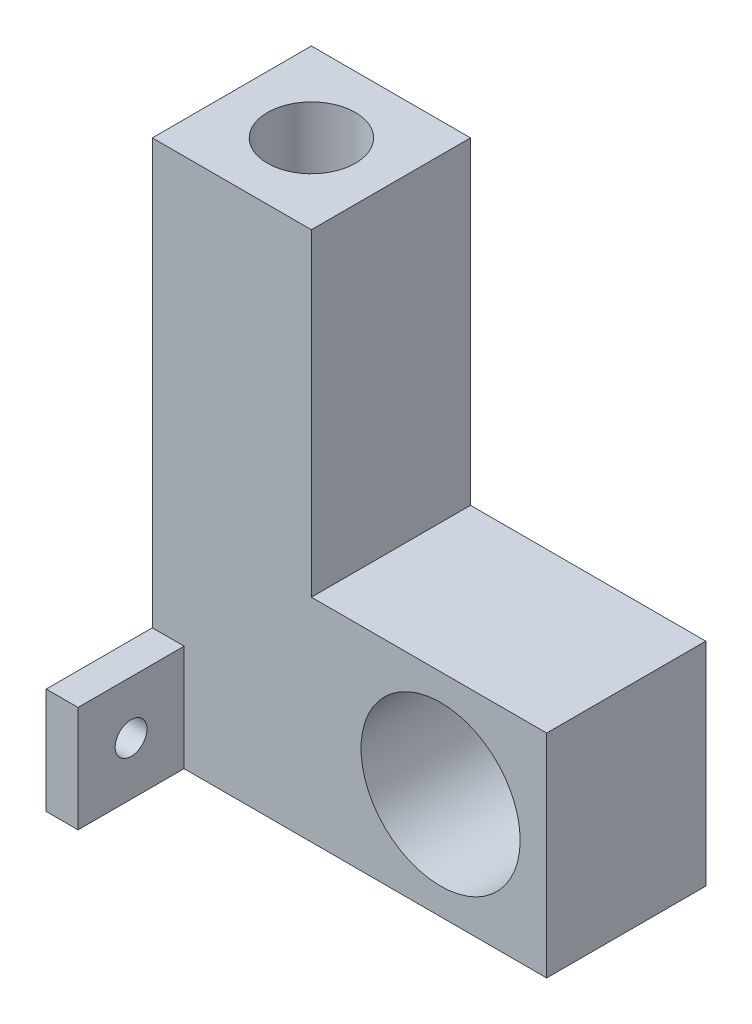
ISO-10303-21;
HEADER;
FILE_DESCRIPTION(('STEP AP214'),'2;1');
FILE_NAME('part.step','',(''),(''),'','','');
FILE_SCHEMA(('AUTOMOTIVE_DESIGN { 1 0 10303 214 1 1 1 1 }'));
ENDSEC;
DATA;
#1=APPLICATION_CONTEXT('core data for automotive mechanical design processes');
#2=APPLICATION_PROTOCOL_DEFINITION('international standard','automotive_design',2000,#1);
#3=PRODUCT_CONTEXT('',#1,'mechanical');
#4=PRODUCT('Part','Part','',(#3));
#5=PRODUCT_RELATED_PRODUCT_CATEGORY('part','',(#4));
#6=PRODUCT_DEFINITION_FORMATION('','',#4);
#7=PRODUCT_DEFINITION_CONTEXT('part definition',#1,'design');
#8=PRODUCT_DEFINITION('design','',#6,#7);
#9=PRODUCT_DEFINITION_SHAPE('','',#8);
#10=(LENGTH_UNIT() NAMED_UNIT(*) SI_UNIT(.MILLI.,.METRE.));
#11=(NAMED_UNIT(*) PLANE_ANGLE_UNIT() SI_UNIT($,.RADIAN.));
#12=(NAMED_UNIT(*) SI_UNIT($,.STERADIAN.) SOLID_ANGLE_UNIT());
#13=UNCERTAINTY_MEASURE_WITH_UNIT(LENGTH_MEASURE(1.E-05),#10,'distance_accuracy_value','');
#14=(GEOMETRIC_REPRESENTATION_CONTEXT(3) GLOBAL_UNCERTAINTY_ASSIGNED_CONTEXT((#13)) GLOBAL_UNIT_ASSIGNED_CONTEXT((#10,
#11,#12)) REPRESENTATION_CONTEXT('',''));
#15=CARTESIAN_POINT('',(0.,0.,0.));
#16=DIRECTION('',(0.,0.,1.));
#17=DIRECTION('',(1.,0.,0.));
#18=AXIS2_PLACEMENT_3D('',#15,#16,#17);
#19=CARTESIAN_POINT('',(0.,-10.,15.));
#20=DIRECTION('',(0.,-1.,0.));
#21=DIRECTION('',(0.,0.,-1.));
#22=AXIS2_PLACEMENT_3D('',#19,#20,#21);
#23=PLANE('',#22);
#24=DIRECTION('',(-1.,0.,0.));
#25=VECTOR('',#24,1.);
#26=CARTESIAN_POINT('',(0.,-10.,15.));
#27=LINE('',#26,#25);
#28=CARTESIAN_POINT('',(10.,-10.,15.));
#29=VERTEX_POINT('',#28);
#30=CARTESIAN_POINT('',(-24.1801195892989,-10.,15.));
#31=VERTEX_POINT('',#30);
#32=EDGE_CURVE('E358',#29,#31,#27,.T.);
#33=ORIENTED_EDGE('',*,*,#32,.T.);
#34=DIRECTION('',(0.,0.,1.));
#35=VECTOR('',#34,1.);
#36=CARTESIAN_POINT('',(-24.1801195892989,-10.,-10.));
#37=LINE('',#36,#35);
#38=CARTESIAN_POINT('',(-24.1801195892989,-10.,25.));
#39=VERTEX_POINT('',#38);
#40=EDGE_CURVE('E302',#31,#39,#37,.T.);
#41=ORIENTED_EDGE('',*,*,#40,.T.);
#42=DIRECTION('',(-1.,0.,0.));
#43=VECTOR('',#42,1.);
#44=CARTESIAN_POINT('',(-24.1801195892989,-10.,25.));
#45=LINE('',#44,#43);
#46=CARTESIAN_POINT('',(-27.1801195892989,-10.,25.));
#47=VERTEX_POINT('',#46);
#48=EDGE_CURVE('E292',#39,#47,#45,.T.);
#49=ORIENTED_EDGE('',*,*,#48,.T.);
#50=DIRECTION('',(0.,0.,-1.));
#51=VECTOR('',#50,1.);
#52=CARTESIAN_POINT('',(-27.1801195892989,-10.,15.));
#53=LINE('',#52,#51);
#54=CARTESIAN_POINT('',(-27.1801195892989,-10.,-10.));
#55=VERTEX_POINT('',#54);
#56=EDGE_CURVE('E286',#47,#55,#53,.T.);
#57=ORIENTED_EDGE('',*,*,#56,.T.);
#58=DIRECTION('',(-1.,0.,0.));
#59=VECTOR('',#58,1.);
#60=CARTESIAN_POINT('',(-24.1801195892989,-10.,-10.));
#61=LINE('',#60,#59);
#62=CARTESIAN_POINT('',(-24.1801195892989,-10.,-10.));
#63=VERTEX_POINT('',#62);
#64=EDGE_CURVE('E280',#63,#55,#61,.T.);
#65=ORIENTED_EDGE('',*,*,#64,.F.);
#66=CARTESIAN_POINT('',(-24.1801195892989,-10.,0.));
#67=VERTEX_POINT('',#66);
#68=EDGE_CURVE('E284',#63,#67,#37,.T.);
#69=ORIENTED_EDGE('',*,*,#68,.T.);
#70=DIRECTION('',(-1.,0.,0.));
#71=VECTOR('',#70,1.);
#72=CARTESIAN_POINT('',(0.,-10.,0.));
#73=LINE('',#72,#71);
#74=CARTESIAN_POINT('',(10.,-10.,0.));
#75=VERTEX_POINT('',#74);
#76=EDGE_CURVE('E212',#75,#67,#73,.T.);
#77=ORIENTED_EDGE('',*,*,#76,.F.);
#78=DIRECTION('',(0.,0.,-1.));
#79=VECTOR('',#78,1.);
#80=CARTESIAN_POINT('',(10.,-10.,15.));
#81=LINE('',#80,#79);
#82=EDGE_CURVE('E377',#29,#75,#81,.T.);
#83=ORIENTED_EDGE('',*,*,#82,.F.);
#84=EDGE_LOOP('',(#33,#41,#49,#57,#65,#69,#77,#83));
#85=FACE_BOUND('',#84,.T.);
#86=CARTESIAN_POINT('',(-19.6801195892989,-10.,7.5));
#87=DIRECTION('',(0.,1.,0.));
#88=DIRECTION('',(0.,0.,1.));
#89=AXIS2_PLACEMENT_3D('',#86,#87,#88);
#90=CIRCLE('',#89,4.15);
#91=CARTESIAN_POINT('',(-19.6801195892989,-10.,11.65));
#92=VERTEX_POINT('',#91);
#93=EDGE_CURVE('E347',#92,#92,#90,.T.);
#94=ORIENTED_EDGE('',*,*,#93,.T.);
#95=EDGE_LOOP('',(#94));
#96=FACE_BOUND('',#95,.T.);
#97=ADVANCED_FACE('F191',(#85,#96),#23,.T.);
#98=CARTESIAN_POINT('',(0.,10.,15.));
#99=DIRECTION('',(0.,1.,0.));
#100=DIRECTION('',(0.,0.,1.));
#101=AXIS2_PLACEMENT_3D('',#98,#99,#100);
#102=PLANE('',#101);
#103=DIRECTION('',(1.,0.,0.));
#104=VECTOR('',#103,1.);
#105=CARTESIAN_POINT('',(0.,10.,0.));
#106=LINE('',#105,#104);
#107=CARTESIAN_POINT('',(-12.1801195892989,10.,0.));
#108=VERTEX_POINT('',#107);
#109=CARTESIAN_POINT('',(10.,10.,0.));
#110=VERTEX_POINT('',#109);
#111=EDGE_CURVE('E380',#108,#110,#106,.T.);
#112=ORIENTED_EDGE('',*,*,#111,.F.);
#113=DIRECTION('',(0.,0.,-1.));
#114=VECTOR('',#113,1.);
#115=CARTESIAN_POINT('',(-12.1801195892989,10.,15.));
#116=LINE('',#115,#114);
#117=CARTESIAN_POINT('',(-12.1801195892989,10.,15.));
#118=VERTEX_POINT('',#117);
#119=EDGE_CURVE('E397',#118,#108,#116,.T.);
#120=ORIENTED_EDGE('',*,*,#119,.F.);
#121=DIRECTION('',(1.,0.,0.));
#122=VECTOR('',#121,1.);
#123=CARTESIAN_POINT('',(0.,10.,15.));
#124=LINE('',#123,#122);
#125=CARTESIAN_POINT('',(10.,10.,15.));
#126=VERTEX_POINT('',#125);
#127=EDGE_CURVE('E362',#118,#126,#124,.T.);
#128=ORIENTED_EDGE('',*,*,#127,.T.);
#129=DIRECTION('',(0.,0.,-1.));
#130=VECTOR('',#129,1.);
#131=CARTESIAN_POINT('',(10.,10.,15.));
#132=LINE('',#131,#130);
#133=EDGE_CURVE('E408',#126,#110,#132,.T.);
#134=ORIENTED_EDGE('',*,*,#133,.T.);
#135=EDGE_LOOP('',(#112,#120,#128,#134));
#136=FACE_BOUND('',#135,.T.);
#137=ADVANCED_FACE('F451',(#136),#102,.T.);
#138=CARTESIAN_POINT('',(-12.1801195892989,0.,15.));
#139=DIRECTION('',(-1.,0.,0.));
#140=DIRECTION('',(0.,0.,1.));
#141=AXIS2_PLACEMENT_3D('',#138,#139,#140);
#142=PLANE('',#141);
#143=DIRECTION('',(0.,1.,0.));
#144=VECTOR('',#143,1.);
#145=CARTESIAN_POINT('',(-12.1801195892989,0.,0.));
#146=LINE('',#145,#144);
#147=CARTESIAN_POINT('',(-12.1801195892989,40.,0.));
#148=VERTEX_POINT('',#147);
#149=EDGE_CURVE('E384',#108,#148,#146,.T.);
#150=ORIENTED_EDGE('',*,*,#149,.T.);
#151=DIRECTION('',(0.,0.,-1.));
#152=VECTOR('',#151,1.);
#153=CARTESIAN_POINT('',(-12.1801195892989,40.,15.));
#154=LINE('',#153,#152);
#155=CARTESIAN_POINT('',(-12.1801195892989,40.,15.));
#156=VERTEX_POINT('',#155);
#157=EDGE_CURVE('E393',#156,#148,#154,.T.);
#158=ORIENTED_EDGE('',*,*,#157,.F.);
#159=DIRECTION('',(0.,1.,0.));
#160=VECTOR('',#159,1.);
#161=CARTESIAN_POINT('',(-12.1801195892989,0.,15.));
#162=LINE('',#161,#160);
#163=EDGE_CURVE('E366',#118,#156,#162,.T.);
#164=ORIENTED_EDGE('',*,*,#163,.F.);
#165=ORIENTED_EDGE('',*,*,#119,.T.);
#166=EDGE_LOOP('',(#150,#158,#164,#165));
#167=FACE_BOUND('',#166,.T.);
#168=ADVANCED_FACE('F460',(#167),#142,.F.);
#169=CARTESIAN_POINT('',(0.,40.,15.));
#170=DIRECTION('',(0.,-1.,0.));
#171=DIRECTION('',(0.,0.,-1.));
#172=AXIS2_PLACEMENT_3D('',#169,#170,#171);
#173=PLANE('',#172);
#174=CARTESIAN_POINT('',(-19.6801195892989,40.,7.5));
#175=DIRECTION('',(0.,1.,0.));
#176=DIRECTION('',(0.,0.,1.));
#177=AXIS2_PLACEMENT_3D('',#174,#175,#176);
#178=CIRCLE('',#177,4.15);
#179=CARTESIAN_POINT('',(-19.6801195892989,40.,11.65));
#180=VERTEX_POINT('',#179);
#181=EDGE_CURVE('E346',#180,#180,#178,.T.);
#182=ORIENTED_EDGE('',*,*,#181,.F.);
#183=EDGE_LOOP('',(#182));
#184=FACE_BOUND('',#183,.T.);
#185=DIRECTION('',(-1.,0.,0.));
#186=VECTOR('',#185,1.);
#187=CARTESIAN_POINT('',(0.,40.,0.));
#188=LINE('',#187,#186);
#189=CARTESIAN_POINT('',(-27.1801195892989,40.,0.));
#190=VERTEX_POINT('',#189);
#191=EDGE_CURVE('E359',#148,#190,#188,.T.);
#192=ORIENTED_EDGE('',*,*,#191,.T.);
#193=DIRECTION('',(0.,0.,-1.));
#194=VECTOR('',#193,1.);
#195=CARTESIAN_POINT('',(-27.1801195892989,40.,15.));
#196=LINE('',#195,#194);
#197=CARTESIAN_POINT('',(-27.1801195892989,40.,15.));
#198=VERTEX_POINT('',#197);
#199=EDGE_CURVE('E373',#198,#190,#196,.T.);
#200=ORIENTED_EDGE('',*,*,#199,.F.);
#201=DIRECTION('',(-1.,0.,0.));
#202=VECTOR('',#201,1.);
#203=CARTESIAN_POINT('',(0.,40.,15.));
#204=LINE('',#203,#202);
#205=EDGE_CURVE('E369',#156,#198,#204,.T.);
#206=ORIENTED_EDGE('',*,*,#205,.F.);
#207=ORIENTED_EDGE('',*,*,#157,.T.);
#208=EDGE_LOOP('',(#192,#200,#206,#207));
#209=FACE_BOUND('',#208,.T.);
#210=ADVANCED_FACE('F462',(#184,#209),#173,.F.);
#211=CARTESIAN_POINT('',(-27.1801195892989,0.,15.));
#212=DIRECTION('',(-1.,0.,0.));
#213=DIRECTION('',(0.,0.,1.));
#214=AXIS2_PLACEMENT_3D('',#211,#212,#213);
#215=PLANE('',#214);
#216=DIRECTION('',(0.,1.,0.));
#217=VECTOR('',#216,1.);
#218=CARTESIAN_POINT('',(-27.1801195892989,0.,0.));
#219=LINE('',#218,#217);
#220=CARTESIAN_POINT('',(-27.1801195892989,0.,0.));
#221=VERTEX_POINT('',#220);
#222=EDGE_CURVE('E374',#221,#190,#219,.T.);
#223=ORIENTED_EDGE('',*,*,#222,.F.);
#224=DIRECTION('',(0.,0.,-1.));
#225=VECTOR('',#224,1.);
#226=CARTESIAN_POINT('',(-27.1801195892989,0.,-10.));
#227=LINE('',#226,#225);
#228=CARTESIAN_POINT('',(-27.1801195892989,0.,-10.));
#229=VERTEX_POINT('',#228);
#230=EDGE_CURVE('E313',#221,#229,#227,.T.);
#231=ORIENTED_EDGE('',*,*,#230,.T.);
#232=DIRECTION('',(0.,-1.,0.));
#233=VECTOR('',#232,1.);
#234=CARTESIAN_POINT('',(-27.1801195892989,-10.,-10.));
#235=LINE('',#234,#233);
#236=EDGE_CURVE('E326',#229,#55,#235,.T.);
#237=ORIENTED_EDGE('',*,*,#236,.T.);
#238=ORIENTED_EDGE('',*,*,#56,.F.);
#239=DIRECTION('',(0.,1.,0.));
#240=VECTOR('',#239,1.);
#241=CARTESIAN_POINT('',(-27.1801195892989,-10.,25.));
#242=LINE('',#241,#240);
#243=CARTESIAN_POINT('',(-27.1801195892989,0.,25.));
#244=VERTEX_POINT('',#243);
#245=EDGE_CURVE('E329',#47,#244,#242,.T.);
#246=ORIENTED_EDGE('',*,*,#245,.T.);
#247=CARTESIAN_POINT('',(-27.1801195892989,0.,15.));
#248=VERTEX_POINT('',#247);
#249=EDGE_CURVE('E309',#244,#248,#227,.T.);
#250=ORIENTED_EDGE('',*,*,#249,.T.);
#251=DIRECTION('',(0.,1.,0.));
#252=VECTOR('',#251,1.);
#253=CARTESIAN_POINT('',(-27.1801195892989,0.,15.));
#254=LINE('',#253,#252);
#255=EDGE_CURVE('E355',#248,#198,#254,.T.);
#256=ORIENTED_EDGE('',*,*,#255,.T.);
#257=ORIENTED_EDGE('',*,*,#199,.T.);
#258=EDGE_LOOP('',(#223,#231,#237,#238,#246,#250,#256,#257));
#259=FACE_BOUND('',#258,.T.);
#260=CARTESIAN_POINT('',(-27.1801195892989,-5.,20.));
#261=DIRECTION('',(-1.,0.,0.));
#262=DIRECTION('',(0.,0.,1.));
#263=AXIS2_PLACEMENT_3D('',#260,#261,#262);
#264=CIRCLE('',#263,1.5);
#265=CARTESIAN_POINT('',(-27.1801195892989,-5.,21.5));
#266=VERTEX_POINT('',#265);
#267=EDGE_CURVE('E520',#266,#266,#264,.T.);
#268=ORIENTED_EDGE('',*,*,#267,.F.);
#269=EDGE_LOOP('',(#268));
#270=FACE_BOUND('',#269,.T.);
#271=CARTESIAN_POINT('',(-27.1801195892989,-5.,-5.));
#272=DIRECTION('',(-1.,0.,0.));
#273=DIRECTION('',(0.,0.,1.));
#274=AXIS2_PLACEMENT_3D('',#271,#272,#273);
#275=CIRCLE('',#274,1.5);
#276=CARTESIAN_POINT('',(-27.1801195892989,-5.,-3.5));
#277=VERTEX_POINT('',#276);
#278=EDGE_CURVE('E316',#277,#277,#275,.T.);
#279=ORIENTED_EDGE('',*,*,#278,.F.);
#280=EDGE_LOOP('',(#279));
#281=FACE_BOUND('',#280,.T.);
#282=ADVANCED_FACE('F438',(#259,#270,#281),#215,.T.);
#283=CARTESIAN_POINT('',(0.,0.,0.));
#284=DIRECTION('',(0.,0.,1.));
#285=DIRECTION('',(1.,0.,0.));
#286=AXIS2_PLACEMENT_3D('',#283,#284,#285);
#287=PLANE('',#286);
#288=DIRECTION('',(0.,1.,0.));
#289=VECTOR('',#288,1.);
#290=CARTESIAN_POINT('',(-24.1801195892989,0.,0.));
#291=LINE('',#290,#289);
#292=CARTESIAN_POINT('',(-24.1801195892989,0.,0.));
#293=VERTEX_POINT('',#292);
#294=EDGE_CURVE('E207',#67,#293,#291,.T.);
#295=ORIENTED_EDGE('',*,*,#294,.T.);
#296=DIRECTION('',(-1.,0.,0.));
#297=VECTOR('',#296,1.);
#298=CARTESIAN_POINT('',(0.,0.,0.));
#299=LINE('',#298,#297);
#300=EDGE_CURVE('E343',#293,#221,#299,.T.);
#301=ORIENTED_EDGE('',*,*,#300,.T.);
#302=ORIENTED_EDGE('',*,*,#222,.T.);
#303=ORIENTED_EDGE('',*,*,#191,.F.);
#304=ORIENTED_EDGE('',*,*,#149,.F.);
#305=ORIENTED_EDGE('',*,*,#111,.T.);
#306=DIRECTION('',(0.,1.,0.));
#307=VECTOR('',#306,1.);
#308=CARTESIAN_POINT('',(10.,0.,0.));
#309=LINE('',#308,#307);
#310=EDGE_CURVE('E405',#75,#110,#309,.T.);
#311=ORIENTED_EDGE('',*,*,#310,.F.);
#312=ORIENTED_EDGE('',*,*,#76,.T.);
#313=EDGE_LOOP('',(#295,#301,#302,#303,#304,#305,#311,#312));
#314=FACE_BOUND('',#313,.T.);
#315=CARTESIAN_POINT('',(0.,0.,0.));
#316=DIRECTION('',(0.,0.,1.));
#317=DIRECTION('',(1.,0.,0.));
#318=AXIS2_PLACEMENT_3D('',#315,#316,#317);
#319=CIRCLE('',#318,7.5);
#320=CARTESIAN_POINT('',(7.5,0.,0.));
#321=VERTEX_POINT('',#320);
#322=EDGE_CURVE('E351',#321,#321,#319,.T.);
#323=ORIENTED_EDGE('',*,*,#322,.T.);
#324=EDGE_LOOP('',(#323));
#325=FACE_BOUND('',#324,.T.);
#326=ADVANCED_FACE('F455',(#314,#325),#287,.F.);
#327=CARTESIAN_POINT('',(0.,0.,15.));
#328=DIRECTION('',(0.,0.,1.));
#329=DIRECTION('',(1.,0.,0.));
#330=AXIS2_PLACEMENT_3D('',#327,#328,#329);
#331=PLANE('',#330);
#332=DIRECTION('',(-1.,0.,0.));
#333=VECTOR('',#332,1.);
#334=CARTESIAN_POINT('',(0.,0.,15.));
#335=LINE('',#334,#333);
#336=CARTESIAN_POINT('',(-24.1801195892989,0.,15.));
#337=VERTEX_POINT('',#336);
#338=EDGE_CURVE('E12',#337,#248,#335,.T.);
#339=ORIENTED_EDGE('',*,*,#338,.F.);
#340=DIRECTION('',(0.,1.,0.));
#341=VECTOR('',#340,1.);
#342=CARTESIAN_POINT('',(-24.1801195892989,0.,15.));
#343=LINE('',#342,#341);
#344=EDGE_CURVE('E200',#31,#337,#343,.T.);
#345=ORIENTED_EDGE('',*,*,#344,.F.);
#346=ORIENTED_EDGE('',*,*,#32,.F.);
#347=DIRECTION('',(0.,1.,0.));
#348=VECTOR('',#347,1.);
#349=CARTESIAN_POINT('',(10.,0.,15.));
#350=LINE('',#349,#348);
#351=EDGE_CURVE('E402',#29,#126,#350,.T.);
#352=ORIENTED_EDGE('',*,*,#351,.T.);
#353=ORIENTED_EDGE('',*,*,#127,.F.);
#354=ORIENTED_EDGE('',*,*,#163,.T.);
#355=ORIENTED_EDGE('',*,*,#205,.T.);
#356=ORIENTED_EDGE('',*,*,#255,.F.);
#357=EDGE_LOOP('',(#339,#345,#346,#352,#353,#354,#355,#356));
#358=FACE_BOUND('',#357,.T.);
#359=CARTESIAN_POINT('',(0.,0.,15.));
#360=DIRECTION('',(0.,0.,1.));
#361=DIRECTION('',(1.,0.,0.));
#362=AXIS2_PLACEMENT_3D('',#359,#360,#361);
#363=CIRCLE('',#362,7.5);
#364=CARTESIAN_POINT('',(7.5,0.,15.));
#365=VERTEX_POINT('',#364);
#366=EDGE_CURVE('E415',#365,#365,#363,.T.);
#367=ORIENTED_EDGE('',*,*,#366,.F.);
#368=EDGE_LOOP('',(#367));
#369=FACE_BOUND('',#368,.T.);
#370=ADVANCED_FACE('F433',(#358,#369),#331,.T.);
#371=CARTESIAN_POINT('',(10.,0.,15.));
#372=DIRECTION('',(-1.,0.,0.));
#373=DIRECTION('',(0.,-1.,0.));
#374=AXIS2_PLACEMENT_3D('',#371,#372,#373);
#375=PLANE('',#374);
#376=ORIENTED_EDGE('',*,*,#310,.T.);
#377=ORIENTED_EDGE('',*,*,#133,.F.);
#378=ORIENTED_EDGE('',*,*,#351,.F.);
#379=ORIENTED_EDGE('',*,*,#82,.T.);
#380=EDGE_LOOP('',(#376,#377,#378,#379));
#381=FACE_BOUND('',#380,.T.);
#382=ADVANCED_FACE('F453',(#381),#375,.F.);
#383=CARTESIAN_POINT('',(0.,0.,15.));
#384=DIRECTION('',(0.,0.,-1.));
#385=DIRECTION('',(-1.,0.,0.));
#386=AXIS2_PLACEMENT_3D('',#383,#384,#385);
#387=CYLINDRICAL_SURFACE('',#386,7.5);
#388=ORIENTED_EDGE('',*,*,#366,.T.);
#389=EDGE_LOOP('',(#388));
#390=FACE_BOUND('',#389,.T.);
#391=ORIENTED_EDGE('',*,*,#322,.F.);
#392=EDGE_LOOP('',(#391));
#393=FACE_BOUND('',#392,.T.);
#394=ADVANCED_FACE('F193',(#390,#393),#387,.F.);
#395=CARTESIAN_POINT('',(-19.6801195892989,-10.,7.5));
#396=DIRECTION('',(0.,1.,0.));
#397=DIRECTION('',(0.,0.,1.));
#398=AXIS2_PLACEMENT_3D('',#395,#396,#397);
#399=CYLINDRICAL_SURFACE('',#398,4.15);
#400=ORIENTED_EDGE('',*,*,#93,.F.);
#401=EDGE_LOOP('',(#400));
#402=FACE_BOUND('',#401,.T.);
#403=ORIENTED_EDGE('',*,*,#181,.T.);
#404=EDGE_LOOP('',(#403));
#405=FACE_BOUND('',#404,.T.);
#406=ADVANCED_FACE('F485',(#402,#405),#399,.F.);
#407=CARTESIAN_POINT('',(-24.1801195892989,-5.,20.));
#408=DIRECTION('',(-1.,0.,0.));
#409=DIRECTION('',(0.,0.,1.));
#410=AXIS2_PLACEMENT_3D('',#407,#408,#409);
#411=CYLINDRICAL_SURFACE('',#410,1.5);
#412=CARTESIAN_POINT('',(-24.1801195892989,-5.,20.));
#413=DIRECTION('',(-1.,0.,0.));
#414=DIRECTION('',(0.,0.,1.));
#415=AXIS2_PLACEMENT_3D('',#412,#413,#414);
#416=CIRCLE('',#415,1.5);
#417=CARTESIAN_POINT('',(-24.1801195892989,-5.,21.5));
#418=VERTEX_POINT('',#417);
#419=EDGE_CURVE('E517',#418,#418,#416,.T.);
#420=ORIENTED_EDGE('',*,*,#419,.F.);
#421=EDGE_LOOP('',(#420));
#422=FACE_BOUND('',#421,.T.);
#423=ORIENTED_EDGE('',*,*,#267,.T.);
#424=EDGE_LOOP('',(#423));
#425=FACE_BOUND('',#424,.T.);
#426=ADVANCED_FACE('F494',(#422,#425),#411,.F.);
#427=CARTESIAN_POINT('',(-24.1801195892989,-10.,25.));
#428=DIRECTION('',(0.,0.,1.));
#429=DIRECTION('',(1.,0.,0.));
#430=AXIS2_PLACEMENT_3D('',#427,#428,#429);
#431=PLANE('',#430);
#432=ORIENTED_EDGE('',*,*,#245,.F.);
#433=ORIENTED_EDGE('',*,*,#48,.F.);
#434=DIRECTION('',(0.,1.,0.));
#435=VECTOR('',#434,1.);
#436=CARTESIAN_POINT('',(-24.1801195892989,-10.,25.));
#437=LINE('',#436,#435);
#438=CARTESIAN_POINT('',(-24.1801195892989,0.,25.));
#439=VERTEX_POINT('',#438);
#440=EDGE_CURVE('E301',#39,#439,#437,.T.);
#441=ORIENTED_EDGE('',*,*,#440,.T.);
#442=DIRECTION('',(-1.,0.,0.));
#443=VECTOR('',#442,1.);
#444=CARTESIAN_POINT('',(-24.1801195892989,0.,25.));
#445=LINE('',#444,#443);
#446=EDGE_CURVE('E336',#439,#244,#445,.T.);
#447=ORIENTED_EDGE('',*,*,#446,.T.);
#448=EDGE_LOOP('',(#432,#433,#441,#447));
#449=FACE_BOUND('',#448,.T.);
#450=ADVANCED_FACE('F443',(#449),#431,.T.);
#451=CARTESIAN_POINT('',(-24.1801195892989,0.,0.));
#452=DIRECTION('',(1.,0.,0.));
#453=DIRECTION('',(0.,0.,-1.));
#454=AXIS2_PLACEMENT_3D('',#451,#452,#453);
#455=PLANE('',#454);
#456=ORIENTED_EDGE('',*,*,#419,.T.);
#457=EDGE_LOOP('',(#456));
#458=FACE_BOUND('',#457,.T.);
#459=ORIENTED_EDGE('',*,*,#40,.F.);
#460=ORIENTED_EDGE('',*,*,#344,.T.);
#461=DIRECTION('',(0.,0.,-1.));
#462=VECTOR('',#461,1.);
#463=CARTESIAN_POINT('',(-24.1801195892989,0.,-10.));
#464=LINE('',#463,#462);
#465=EDGE_CURVE('E293',#439,#337,#464,.T.);
#466=ORIENTED_EDGE('',*,*,#465,.F.);
#467=ORIENTED_EDGE('',*,*,#440,.F.);
#468=EDGE_LOOP('',(#459,#460,#466,#467));
#469=FACE_BOUND('',#468,.T.);
#470=ADVANCED_FACE('F425',(#458,#469),#455,.T.);
#471=CARTESIAN_POINT('',(-24.1801195892989,0.,-10.));
#472=DIRECTION('',(0.,1.,0.));
#473=DIRECTION('',(0.,0.,1.));
#474=AXIS2_PLACEMENT_3D('',#471,#472,#473);
#475=PLANE('',#474);
#476=ORIENTED_EDGE('',*,*,#465,.T.);
#477=ORIENTED_EDGE('',*,*,#338,.T.);
#478=ORIENTED_EDGE('',*,*,#249,.F.);
#479=ORIENTED_EDGE('',*,*,#446,.F.);
#480=EDGE_LOOP('',(#476,#477,#478,#479));
#481=FACE_BOUND('',#480,.T.);
#482=ADVANCED_FACE('F430',(#481),#475,.T.);
#483=ORIENTED_EDGE('',*,*,#300,.F.);
#484=CARTESIAN_POINT('',(-24.1801195892989,0.,-10.));
#485=VERTEX_POINT('',#484);
#486=EDGE_CURVE('E322',#293,#485,#464,.T.);
#487=ORIENTED_EDGE('',*,*,#486,.T.);
#488=DIRECTION('',(-1.,0.,0.));
#489=VECTOR('',#488,1.);
#490=CARTESIAN_POINT('',(-24.1801195892989,0.,-10.));
#491=LINE('',#490,#489);
#492=EDGE_CURVE('E307',#485,#229,#491,.T.);
#493=ORIENTED_EDGE('',*,*,#492,.T.);
#494=ORIENTED_EDGE('',*,*,#230,.F.);
#495=EDGE_LOOP('',(#483,#487,#493,#494));
#496=FACE_BOUND('',#495,.T.);
#497=ADVANCED_FACE('F503',(#496),#475,.T.);
#498=CARTESIAN_POINT('',(-24.1801195892989,-5.,-5.));
#499=DIRECTION('',(-1.,0.,0.));
#500=DIRECTION('',(0.,0.,1.));
#501=AXIS2_PLACEMENT_3D('',#498,#499,#500);
#502=CIRCLE('',#501,1.5);
#503=CARTESIAN_POINT('',(-24.1801195892989,-5.,-3.5));
#504=VERTEX_POINT('',#503);
#505=EDGE_CURVE('E330',#504,#504,#502,.T.);
#506=ORIENTED_EDGE('',*,*,#505,.T.);
#507=EDGE_LOOP('',(#506));
#508=FACE_BOUND('',#507,.T.);
#509=ORIENTED_EDGE('',*,*,#294,.F.);
#510=ORIENTED_EDGE('',*,*,#68,.F.);
#511=DIRECTION('',(0.,-1.,0.));
#512=VECTOR('',#511,1.);
#513=CARTESIAN_POINT('',(-24.1801195892989,-10.,-10.));
#514=LINE('',#513,#512);
#515=EDGE_CURVE('E299',#485,#63,#514,.T.);
#516=ORIENTED_EDGE('',*,*,#515,.F.);
#517=ORIENTED_EDGE('',*,*,#486,.F.);
#518=EDGE_LOOP('',(#509,#510,#516,#517));
#519=FACE_BOUND('',#518,.T.);
#520=ADVANCED_FACE('F297',(#508,#519),#455,.T.);
#521=CARTESIAN_POINT('',(-24.1801195892989,-10.,-10.));
#522=DIRECTION('',(0.,0.,-1.));
#523=DIRECTION('',(-1.,0.,0.));
#524=AXIS2_PLACEMENT_3D('',#521,#522,#523);
#525=PLANE('',#524);
#526=ORIENTED_EDGE('',*,*,#236,.F.);
#527=ORIENTED_EDGE('',*,*,#492,.F.);
#528=ORIENTED_EDGE('',*,*,#515,.T.);
#529=ORIENTED_EDGE('',*,*,#64,.T.);
#530=EDGE_LOOP('',(#526,#527,#528,#529));
#531=FACE_BOUND('',#530,.T.);
#532=ADVANCED_FACE('F305',(#531),#525,.T.);
#533=CARTESIAN_POINT('',(-24.1801195892989,-5.,-5.));
#534=DIRECTION('',(-1.,0.,0.));
#535=DIRECTION('',(0.,0.,1.));
#536=AXIS2_PLACEMENT_3D('',#533,#534,#535);
#537=CYLINDRICAL_SURFACE('',#536,1.5);
#538=ORIENTED_EDGE('',*,*,#505,.F.);
#539=EDGE_LOOP('',(#538));
#540=FACE_BOUND('',#539,.T.);
#541=ORIENTED_EDGE('',*,*,#278,.T.);
#542=EDGE_LOOP('',(#541));
#543=FACE_BOUND('',#542,.T.);
#544=ADVANCED_FACE('F498',(#540,#543),#537,.F.);
#545=CLOSED_SHELL('',(#97,#137,#168,#210,#282,#326,#370,#382,#394,#406,#426,#450,#470,#482,#497,
#520,#532,#544));
#546=MANIFOLD_SOLID_BREP('B2',#545);
#547=ADVANCED_BREP_SHAPE_REPRESENTATION('',(#18,#546),#14);
#548=SHAPE_DEFINITION_REPRESENTATION(#9,#547);
ENDSEC;
END-ISO-10303-21;
